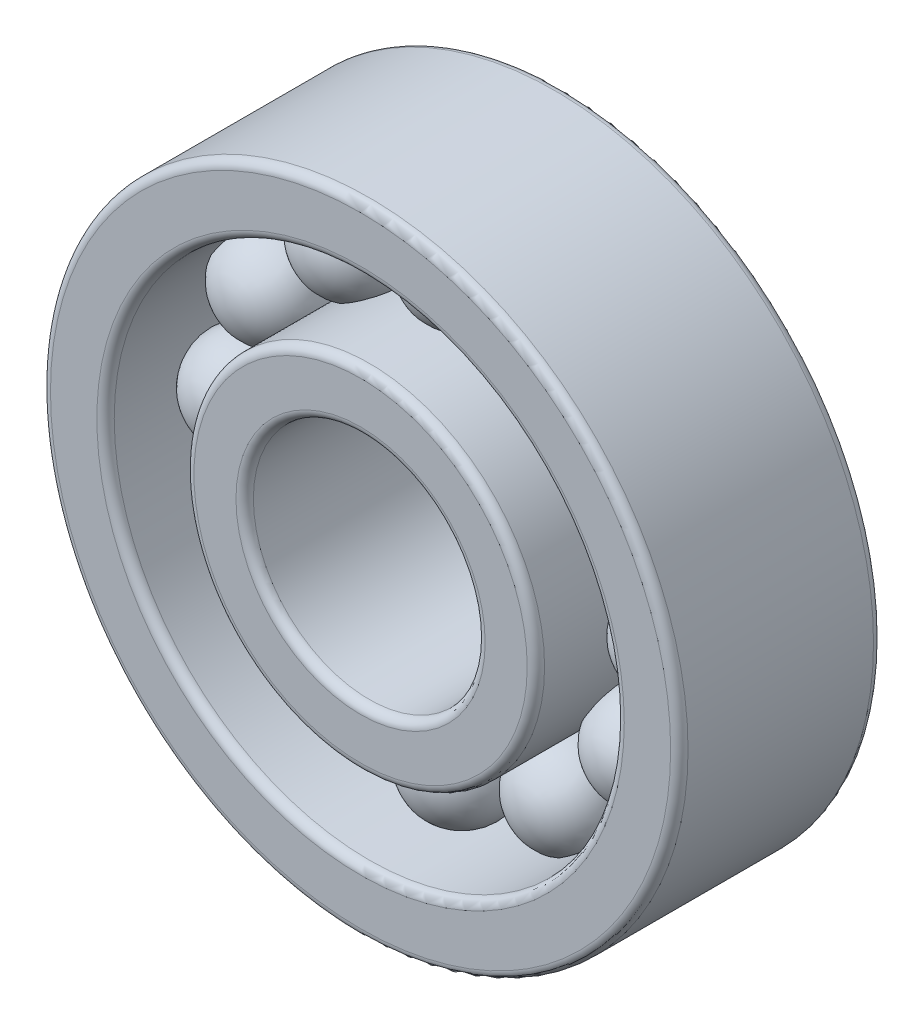
ISO-10303-21;
HEADER;
FILE_DESCRIPTION(('STEP AP214'),'2;1');
FILE_NAME('part.step','',(''),(''),'','','');
FILE_SCHEMA(('AUTOMOTIVE_DESIGN { 1 0 10303 214 1 1 1 1 }'));
ENDSEC;
DATA;
#1=APPLICATION_CONTEXT('core data for automotive mechanical design processes');
#2=APPLICATION_PROTOCOL_DEFINITION('international standard','automotive_design',2000,#1);
#3=PRODUCT_CONTEXT('',#1,'mechanical');
#4=PRODUCT('Part','Part','',(#3));
#5=PRODUCT_RELATED_PRODUCT_CATEGORY('part','',(#4));
#6=PRODUCT_DEFINITION_FORMATION('','',#4);
#7=PRODUCT_DEFINITION_CONTEXT('part definition',#1,'design');
#8=PRODUCT_DEFINITION('design','',#6,#7);
#9=PRODUCT_DEFINITION_SHAPE('','',#8);
#10=(LENGTH_UNIT() NAMED_UNIT(*) SI_UNIT(.MILLI.,.METRE.));
#11=(NAMED_UNIT(*) PLANE_ANGLE_UNIT() SI_UNIT($,.RADIAN.));
#12=(NAMED_UNIT(*) SI_UNIT($,.STERADIAN.) SOLID_ANGLE_UNIT());
#13=UNCERTAINTY_MEASURE_WITH_UNIT(LENGTH_MEASURE(1.E-05),#10,'distance_accuracy_value','');
#14=(GEOMETRIC_REPRESENTATION_CONTEXT(3) GLOBAL_UNCERTAINTY_ASSIGNED_CONTEXT((#13)) GLOBAL_UNIT_ASSIGNED_CONTEXT((#10,
#11,#12)) REPRESENTATION_CONTEXT('',''));
#15=CARTESIAN_POINT('',(0.,0.,0.));
#16=DIRECTION('',(0.,0.,1.));
#17=DIRECTION('',(1.,0.,0.));
#18=AXIS2_PLACEMENT_3D('',#15,#16,#17);
#19=CARTESIAN_POINT('',(0.,0.,3.2));
#20=DIRECTION('',(0.,0.,1.));
#21=DIRECTION('',(1.,0.,0.));
#22=AXIS2_PLACEMENT_3D('',#19,#20,#21);
#23=TOROIDAL_SURFACE('',#22,9.1,0.3);
#24=CARTESIAN_POINT('',(0.,0.,3.5));
#25=DIRECTION('',(0.,0.,1.));
#26=DIRECTION('',(1.,0.,0.));
#27=AXIS2_PLACEMENT_3D('',#24,#25,#26);
#28=CIRCLE('',#27,9.1);
#29=CARTESIAN_POINT('',(9.1,0.,3.5));
#30=VERTEX_POINT('',#29);
#31=EDGE_CURVE('P0_E20',#30,#30,#28,.T.);
#32=ORIENTED_EDGE('',*,*,#31,.T.);
#33=CARTESIAN_POINT('',(9.1,0.,3.2));
#34=DIRECTION('',(0.,-1.,0.));
#35=DIRECTION('',(1.,0.,0.));
#36=AXIS2_PLACEMENT_3D('',#33,#34,#35);
#37=CIRCLE('',#36,0.3);
#38=CARTESIAN_POINT('',(8.8,0.,3.2));
#39=VERTEX_POINT('',#38);
#40=EDGE_CURVE('P0_E11',#30,#39,#37,.T.);
#41=ORIENTED_EDGE('',*,*,#40,.T.);
#42=CARTESIAN_POINT('',(0.,0.,3.2));
#43=DIRECTION('',(0.,0.,1.));
#44=DIRECTION('',(1.,0.,0.));
#45=AXIS2_PLACEMENT_3D('',#42,#43,#44);
#46=CIRCLE('',#45,8.8);
#47=EDGE_CURVE('P0_E117',#39,#39,#46,.T.);
#48=ORIENTED_EDGE('',*,*,#47,.F.);
#49=ORIENTED_EDGE('',*,*,#40,.F.);
#50=EDGE_LOOP('',(#32,#41,#48,#49));
#51=FACE_BOUND('',#50,.T.);
#52=ADVANCED_FACE('P0_F16',(#51),#23,.T.);
#53=CARTESIAN_POINT('',(0.,0.,3.5));
#54=DIRECTION('',(0.,0.,1.));
#55=DIRECTION('',(1.,0.,0.));
#56=AXIS2_PLACEMENT_3D('',#53,#54,#55);
#57=PLANE('',#56);
#58=CARTESIAN_POINT('',(0.,0.,3.5));
#59=DIRECTION('',(0.,0.,1.));
#60=DIRECTION('',(1.,0.,0.));
#61=AXIS2_PLACEMENT_3D('',#58,#59,#60);
#62=CIRCLE('',#61,10.7);
#63=CARTESIAN_POINT('',(10.7,0.,3.5));
#64=VERTEX_POINT('',#63);
#65=EDGE_CURVE('P0_E66',#64,#64,#62,.T.);
#66=ORIENTED_EDGE('',*,*,#65,.T.);
#67=EDGE_LOOP('',(#66));
#68=FACE_BOUND('',#67,.T.);
#69=ORIENTED_EDGE('',*,*,#31,.F.);
#70=EDGE_LOOP('',(#69));
#71=FACE_BOUND('',#70,.T.);
#72=ADVANCED_FACE('P0_F18',(#68,#71),#57,.T.);
#73=CARTESIAN_POINT('',(0.,0.,3.2));
#74=DIRECTION('',(0.,0.,1.));
#75=DIRECTION('',(1.,0.,0.));
#76=AXIS2_PLACEMENT_3D('',#73,#74,#75);
#77=TOROIDAL_SURFACE('',#76,10.7,0.3);
#78=CARTESIAN_POINT('',(0.,0.,3.2));
#79=DIRECTION('',(0.,0.,1.));
#80=DIRECTION('',(1.,0.,0.));
#81=AXIS2_PLACEMENT_3D('',#78,#79,#80);
#82=CIRCLE('',#81,11.);
#83=CARTESIAN_POINT('',(11.,0.,3.2));
#84=VERTEX_POINT('',#83);
#85=EDGE_CURVE('P0_E65',#84,#84,#82,.T.);
#86=ORIENTED_EDGE('',*,*,#85,.T.);
#87=CARTESIAN_POINT('',(10.7,0.,3.2));
#88=DIRECTION('',(0.,-1.,0.));
#89=DIRECTION('',(1.,0.,0.));
#90=AXIS2_PLACEMENT_3D('',#87,#88,#89);
#91=CIRCLE('',#90,0.3);
#92=EDGE_CURVE('P0_E62',#84,#64,#91,.T.);
#93=ORIENTED_EDGE('',*,*,#92,.T.);
#94=ORIENTED_EDGE('',*,*,#65,.F.);
#95=ORIENTED_EDGE('',*,*,#92,.F.);
#96=EDGE_LOOP('',(#86,#93,#94,#95));
#97=FACE_BOUND('',#96,.T.);
#98=ADVANCED_FACE('P0_F63',(#97),#77,.T.);
#99=CARTESIAN_POINT('',(0.,0.,0.));
#100=DIRECTION('',(0.,0.,1.));
#101=DIRECTION('',(1.,0.,0.));
#102=AXIS2_PLACEMENT_3D('',#99,#100,#101);
#103=CYLINDRICAL_SURFACE('',#102,11.);
#104=CARTESIAN_POINT('',(0.,0.,-3.2));
#105=DIRECTION('',(0.,0.,1.));
#106=DIRECTION('',(1.,0.,0.));
#107=AXIS2_PLACEMENT_3D('',#104,#105,#106);
#108=CIRCLE('',#107,11.);
#109=CARTESIAN_POINT('',(11.,0.,-3.2));
#110=VERTEX_POINT('',#109);
#111=EDGE_CURVE('P0_E80',#110,#110,#108,.T.);
#112=ORIENTED_EDGE('',*,*,#111,.T.);
#113=DIRECTION('',(0.,0.,1.));
#114=VECTOR('',#113,1.);
#115=CARTESIAN_POINT('',(11.,0.,0.));
#116=LINE('',#115,#114);
#117=EDGE_CURVE('P0_E75',#110,#84,#116,.T.);
#118=ORIENTED_EDGE('',*,*,#117,.T.);
#119=ORIENTED_EDGE('',*,*,#85,.F.);
#120=ORIENTED_EDGE('',*,*,#117,.F.);
#121=EDGE_LOOP('',(#112,#118,#119,#120));
#122=FACE_BOUND('',#121,.T.);
#123=ADVANCED_FACE('P0_F95',(#122),#103,.T.);
#124=CARTESIAN_POINT('',(0.,0.,-3.2));
#125=DIRECTION('',(0.,0.,1.));
#126=DIRECTION('',(1.,0.,0.));
#127=AXIS2_PLACEMENT_3D('',#124,#125,#126);
#128=TOROIDAL_SURFACE('',#127,10.7,0.3);
#129=CARTESIAN_POINT('',(0.,0.,-3.5));
#130=DIRECTION('',(0.,0.,1.));
#131=DIRECTION('',(1.,0.,0.));
#132=AXIS2_PLACEMENT_3D('',#129,#130,#131);
#133=CIRCLE('',#132,10.7);
#134=CARTESIAN_POINT('',(10.7,0.,-3.5));
#135=VERTEX_POINT('',#134);
#136=EDGE_CURVE('P0_E84',#135,#135,#133,.T.);
#137=ORIENTED_EDGE('',*,*,#136,.T.);
#138=CARTESIAN_POINT('',(10.7,0.,-3.2));
#139=DIRECTION('',(0.,-1.,0.));
#140=DIRECTION('',(1.,0.,0.));
#141=AXIS2_PLACEMENT_3D('',#138,#139,#140);
#142=CIRCLE('',#141,0.3);
#143=EDGE_CURVE('P0_E83',#135,#110,#142,.T.);
#144=ORIENTED_EDGE('',*,*,#143,.T.);
#145=ORIENTED_EDGE('',*,*,#111,.F.);
#146=ORIENTED_EDGE('',*,*,#143,.F.);
#147=EDGE_LOOP('',(#137,#144,#145,#146));
#148=FACE_BOUND('',#147,.T.);
#149=ADVANCED_FACE('P0_F98',(#148),#128,.T.);
#150=CARTESIAN_POINT('',(0.,0.,-3.5));
#151=DIRECTION('',(0.,0.,1.));
#152=DIRECTION('',(1.,0.,0.));
#153=AXIS2_PLACEMENT_3D('',#150,#151,#152);
#154=PLANE('',#153);
#155=ORIENTED_EDGE('',*,*,#136,.F.);
#156=EDGE_LOOP('',(#155));
#157=FACE_BOUND('',#156,.T.);
#158=CARTESIAN_POINT('',(0.,0.,-3.5));
#159=DIRECTION('',(0.,0.,1.));
#160=DIRECTION('',(1.,0.,0.));
#161=AXIS2_PLACEMENT_3D('',#158,#159,#160);
#162=CIRCLE('',#161,9.1);
#163=CARTESIAN_POINT('',(9.1,0.,-3.5));
#164=VERTEX_POINT('',#163);
#165=EDGE_CURVE('P0_E78',#164,#164,#162,.T.);
#166=ORIENTED_EDGE('',*,*,#165,.T.);
#167=EDGE_LOOP('',(#166));
#168=FACE_BOUND('',#167,.T.);
#169=ADVANCED_FACE('P0_F101',(#157,#168),#154,.F.);
#170=CARTESIAN_POINT('',(0.,0.,-3.2));
#171=DIRECTION('',(0.,0.,1.));
#172=DIRECTION('',(1.,0.,0.));
#173=AXIS2_PLACEMENT_3D('',#170,#171,#172);
#174=TOROIDAL_SURFACE('',#173,9.1,0.3);
#175=CARTESIAN_POINT('',(0.,0.,-3.2));
#176=DIRECTION('',(0.,0.,1.));
#177=DIRECTION('',(1.,0.,0.));
#178=AXIS2_PLACEMENT_3D('',#175,#176,#177);
#179=CIRCLE('',#178,8.8);
#180=CARTESIAN_POINT('',(8.8,0.,-3.2));
#181=VERTEX_POINT('',#180);
#182=EDGE_CURVE('P0_E113',#181,#181,#179,.T.);
#183=ORIENTED_EDGE('',*,*,#182,.T.);
#184=CARTESIAN_POINT('',(9.1,0.,-3.2));
#185=DIRECTION('',(0.,-1.,0.));
#186=DIRECTION('',(1.,0.,0.));
#187=AXIS2_PLACEMENT_3D('',#184,#185,#186);
#188=CIRCLE('',#187,0.3);
#189=EDGE_CURVE('P0_E110',#181,#164,#188,.T.);
#190=ORIENTED_EDGE('',*,*,#189,.T.);
#191=ORIENTED_EDGE('',*,*,#165,.F.);
#192=ORIENTED_EDGE('',*,*,#189,.F.);
#193=EDGE_LOOP('',(#183,#190,#191,#192));
#194=FACE_BOUND('',#193,.T.);
#195=ADVANCED_FACE('P0_F104',(#194),#174,.T.);
#196=CARTESIAN_POINT('',(0.,0.,0.));
#197=DIRECTION('',(0.,0.,1.));
#198=DIRECTION('',(1.,0.,0.));
#199=AXIS2_PLACEMENT_3D('',#196,#197,#198);
#200=CYLINDRICAL_SURFACE('',#199,8.8);
#201=DIRECTION('',(0.,0.,1.));
#202=VECTOR('',#201,1.);
#203=CARTESIAN_POINT('',(8.8,0.,0.));
#204=LINE('',#203,#202);
#205=EDGE_CURVE('P0_E123',#181,#39,#204,.T.);
#206=ORIENTED_EDGE('',*,*,#205,.T.);
#207=ORIENTED_EDGE('',*,*,#47,.T.);
#208=ORIENTED_EDGE('',*,*,#205,.F.);
#209=ORIENTED_EDGE('',*,*,#182,.F.);
#210=EDGE_LOOP('',(#206,#207,#208,#209));
#211=FACE_BOUND('',#210,.T.);
#212=ADVANCED_FACE('P0_F130',(#211),#200,.F.);
#213=CLOSED_SHELL('',(#52,#72,#98,#123,#149,#169,#195,#212));
#214=MANIFOLD_SOLID_BREP('P0_B1',#213);
#215=CARTESIAN_POINT('',(-6.430238623099,-3.7125,0.));
#216=DIRECTION('',(0.,0.,1.));
#217=DIRECTION('',(-0.866025403784329,-0.50000000000019,0.));
#218=AXIS2_PLACEMENT_3D('',#215,#216,#217);
#219=SPHERICAL_SURFACE('',#218,1.71875);
#220=CARTESIAN_POINT('',(-6.430238623099,-3.7125,-1.71875));
#221=VERTEX_POINT('',#220);
#222=VERTEX_LOOP('',#221);
#223=FACE_BOUND('',#222,.T.);
#224=ADVANCED_FACE('P1_F14',(#223),#219,.T.);
#225=CLOSED_SHELL('',(#224));
#226=MANIFOLD_SOLID_BREP('P1_B1',#225);
#227=CARTESIAN_POINT('',(-3.7125,-6.430238623099,0.));
#228=DIRECTION('',(0.,0.,1.));
#229=DIRECTION('',(-0.50000000000019,-0.866025403784329,0.));
#230=AXIS2_PLACEMENT_3D('',#227,#228,#229);
#231=SPHERICAL_SURFACE('',#230,1.71875);
#232=CARTESIAN_POINT('',(-3.7125,-6.430238623099,-1.71875));
#233=VERTEX_POINT('',#232);
#234=VERTEX_LOOP('',#233);
#235=FACE_BOUND('',#234,.T.);
#236=ADVANCED_FACE('P2_F14',(#235),#231,.T.);
#237=CLOSED_SHELL('',(#236));
#238=MANIFOLD_SOLID_BREP('P2_B1',#237);
#239=CARTESIAN_POINT('',(0.,-7.425,0.));
#240=DIRECTION('',(0.,0.,1.));
#241=DIRECTION('',(0.,-1.,0.));
#242=AXIS2_PLACEMENT_3D('',#239,#240,#241);
#243=SPHERICAL_SURFACE('',#242,1.71875);
#244=CARTESIAN_POINT('',(0.,-7.425,-1.71875));
#245=VERTEX_POINT('',#244);
#246=VERTEX_LOOP('',#245);
#247=FACE_BOUND('',#246,.T.);
#248=ADVANCED_FACE('P3_F14',(#247),#243,.T.);
#249=CLOSED_SHELL('',(#248));
#250=MANIFOLD_SOLID_BREP('P3_B1',#249);
#251=CARTESIAN_POINT('',(3.7125,-6.430238623099,0.));
#252=DIRECTION('',(0.,0.,1.));
#253=DIRECTION('',(0.50000000000019,-0.866025403784329,0.));
#254=AXIS2_PLACEMENT_3D('',#251,#252,#253);
#255=SPHERICAL_SURFACE('',#254,1.71875);
#256=CARTESIAN_POINT('',(3.7125,-6.430238623099,-1.71875));
#257=VERTEX_POINT('',#256);
#258=VERTEX_LOOP('',#257);
#259=FACE_BOUND('',#258,.T.);
#260=ADVANCED_FACE('P4_F14',(#259),#255,.T.);
#261=CLOSED_SHELL('',(#260));
#262=MANIFOLD_SOLID_BREP('P4_B1',#261);
#263=CARTESIAN_POINT('',(6.430238623099,-3.7125,0.));
#264=DIRECTION('',(0.,0.,1.));
#265=DIRECTION('',(0.866025403784329,-0.50000000000019,0.));
#266=AXIS2_PLACEMENT_3D('',#263,#264,#265);
#267=SPHERICAL_SURFACE('',#266,1.71875);
#268=CARTESIAN_POINT('',(6.430238623099,-3.7125,-1.71875));
#269=VERTEX_POINT('',#268);
#270=VERTEX_LOOP('',#269);
#271=FACE_BOUND('',#270,.T.);
#272=ADVANCED_FACE('P5_F14',(#271),#267,.T.);
#273=CLOSED_SHELL('',(#272));
#274=MANIFOLD_SOLID_BREP('P5_B1',#273);
#275=CARTESIAN_POINT('',(0.,0.,3.2));
#276=DIRECTION('',(0.,0.,1.));
#277=DIRECTION('',(1.,0.,0.));
#278=AXIS2_PLACEMENT_3D('',#275,#276,#277);
#279=TOROIDAL_SURFACE('',#278,4.3,0.3);
#280=CARTESIAN_POINT('',(0.,0.,3.5));
#281=DIRECTION('',(0.,0.,1.));
#282=DIRECTION('',(1.,0.,0.));
#283=AXIS2_PLACEMENT_3D('',#280,#281,#282);
#284=CIRCLE('',#283,4.3);
#285=CARTESIAN_POINT('',(4.3,0.,3.5));
#286=VERTEX_POINT('',#285);
#287=EDGE_CURVE('P6_E25',#286,#286,#284,.T.);
#288=ORIENTED_EDGE('',*,*,#287,.T.);
#289=CARTESIAN_POINT('',(4.3,0.,3.2));
#290=DIRECTION('',(0.,-1.,0.));
#291=DIRECTION('',(1.,0.,0.));
#292=AXIS2_PLACEMENT_3D('',#289,#290,#291);
#293=CIRCLE('',#292,0.3);
#294=CARTESIAN_POINT('',(4.,0.,3.2));
#295=VERTEX_POINT('',#294);
#296=EDGE_CURVE('P6_E11',#286,#295,#293,.T.);
#297=ORIENTED_EDGE('',*,*,#296,.T.);
#298=CARTESIAN_POINT('',(0.,0.,3.2));
#299=DIRECTION('',(0.,0.,1.));
#300=DIRECTION('',(1.,0.,0.));
#301=AXIS2_PLACEMENT_3D('',#298,#299,#300);
#302=CIRCLE('',#301,4.);
#303=EDGE_CURVE('P6_E74',#295,#295,#302,.T.);
#304=ORIENTED_EDGE('',*,*,#303,.F.);
#305=ORIENTED_EDGE('',*,*,#296,.F.);
#306=EDGE_LOOP('',(#288,#297,#304,#305));
#307=FACE_BOUND('',#306,.T.);
#308=ADVANCED_FACE('P6_F16',(#307),#279,.T.);
#309=CARTESIAN_POINT('',(0.,0.,3.5));
#310=DIRECTION('',(0.,0.,1.));
#311=DIRECTION('',(1.,0.,0.));
#312=AXIS2_PLACEMENT_3D('',#309,#310,#311);
#313=PLANE('',#312);
#314=CARTESIAN_POINT('',(0.,0.,3.5));
#315=DIRECTION('',(0.,0.,1.));
#316=DIRECTION('',(1.,0.,0.));
#317=AXIS2_PLACEMENT_3D('',#314,#315,#316);
#318=CIRCLE('',#317,5.75);
#319=CARTESIAN_POINT('',(5.75,0.,3.5));
#320=VERTEX_POINT('',#319);
#321=EDGE_CURVE('P6_E82',#320,#320,#318,.T.);
#322=ORIENTED_EDGE('',*,*,#321,.T.);
#323=EDGE_LOOP('',(#322));
#324=FACE_BOUND('',#323,.T.);
#325=ORIENTED_EDGE('',*,*,#287,.F.);
#326=EDGE_LOOP('',(#325));
#327=FACE_BOUND('',#326,.T.);
#328=ADVANCED_FACE('P6_F105',(#324,#327),#313,.T.);
#329=CARTESIAN_POINT('',(0.,0.,3.2));
#330=DIRECTION('',(0.,0.,1.));
#331=DIRECTION('',(1.,0.,0.));
#332=AXIS2_PLACEMENT_3D('',#329,#330,#331);
#333=TOROIDAL_SURFACE('',#332,5.75,0.3);
#334=CARTESIAN_POINT('',(0.,0.,3.2));
#335=DIRECTION('',(0.,0.,1.));
#336=DIRECTION('',(1.,0.,0.));
#337=AXIS2_PLACEMENT_3D('',#334,#335,#336);
#338=CIRCLE('',#337,6.05);
#339=CARTESIAN_POINT('',(6.05,0.,3.2));
#340=VERTEX_POINT('',#339);
#341=EDGE_CURVE('P6_E97',#340,#340,#338,.T.);
#342=ORIENTED_EDGE('',*,*,#341,.T.);
#343=CARTESIAN_POINT('',(5.75,0.,3.2));
#344=DIRECTION('',(0.,-1.,0.));
#345=DIRECTION('',(1.,0.,0.));
#346=AXIS2_PLACEMENT_3D('',#343,#344,#345);
#347=CIRCLE('',#346,0.3);
#348=EDGE_CURVE('P6_E85',#340,#320,#347,.T.);
#349=ORIENTED_EDGE('',*,*,#348,.T.);
#350=ORIENTED_EDGE('',*,*,#321,.F.);
#351=ORIENTED_EDGE('',*,*,#348,.F.);
#352=EDGE_LOOP('',(#342,#349,#350,#351));
#353=FACE_BOUND('',#352,.T.);
#354=ADVANCED_FACE('P6_F107',(#353),#333,.T.);
#355=CARTESIAN_POINT('',(0.,0.,0.));
#356=DIRECTION('',(0.,0.,1.));
#357=DIRECTION('',(1.,0.,0.));
#358=AXIS2_PLACEMENT_3D('',#355,#356,#357);
#359=CYLINDRICAL_SURFACE('',#358,6.05);
#360=CARTESIAN_POINT('',(0.,0.,-3.2));
#361=DIRECTION('',(0.,0.,1.));
#362=DIRECTION('',(1.,0.,0.));
#363=AXIS2_PLACEMENT_3D('',#360,#361,#362);
#364=CIRCLE('',#363,6.05);
#365=CARTESIAN_POINT('',(6.05,0.,-3.2));
#366=VERTEX_POINT('',#365);
#367=EDGE_CURVE('P6_E89',#366,#366,#364,.T.);
#368=ORIENTED_EDGE('',*,*,#367,.T.);
#369=DIRECTION('',(0.,0.,1.));
#370=VECTOR('',#369,1.);
#371=CARTESIAN_POINT('',(6.05,0.,0.));
#372=LINE('',#371,#370);
#373=EDGE_CURVE('P6_E93',#366,#340,#372,.T.);
#374=ORIENTED_EDGE('',*,*,#373,.T.);
#375=ORIENTED_EDGE('',*,*,#341,.F.);
#376=ORIENTED_EDGE('',*,*,#373,.F.);
#377=EDGE_LOOP('',(#368,#374,#375,#376));
#378=FACE_BOUND('',#377,.T.);
#379=ADVANCED_FACE('P6_F114',(#378),#359,.T.);
#380=CARTESIAN_POINT('',(0.,0.,-3.2));
#381=DIRECTION('',(0.,0.,1.));
#382=DIRECTION('',(1.,0.,0.));
#383=AXIS2_PLACEMENT_3D('',#380,#381,#382);
#384=TOROIDAL_SURFACE('',#383,5.75,0.3);
#385=CARTESIAN_POINT('',(0.,0.,-3.5));
#386=DIRECTION('',(0.,0.,1.));
#387=DIRECTION('',(1.,0.,0.));
#388=AXIS2_PLACEMENT_3D('',#385,#386,#387);
#389=CIRCLE('',#388,5.75);
#390=CARTESIAN_POINT('',(5.75,0.,-3.5));
#391=VERTEX_POINT('',#390);
#392=EDGE_CURVE('P6_E72',#391,#391,#389,.T.);
#393=ORIENTED_EDGE('',*,*,#392,.T.);
#394=CARTESIAN_POINT('',(5.75,0.,-3.2));
#395=DIRECTION('',(0.,-1.,0.));
#396=DIRECTION('',(1.,0.,0.));
#397=AXIS2_PLACEMENT_3D('',#394,#395,#396);
#398=CIRCLE('',#397,0.3);
#399=EDGE_CURVE('P6_E81',#391,#366,#398,.T.);
#400=ORIENTED_EDGE('',*,*,#399,.T.);
#401=ORIENTED_EDGE('',*,*,#367,.F.);
#402=ORIENTED_EDGE('',*,*,#399,.F.);
#403=EDGE_LOOP('',(#393,#400,#401,#402));
#404=FACE_BOUND('',#403,.T.);
#405=ADVANCED_FACE('P6_F120',(#404),#384,.T.);
#406=CARTESIAN_POINT('',(0.,0.,-3.5));
#407=DIRECTION('',(0.,0.,1.));
#408=DIRECTION('',(1.,0.,0.));
#409=AXIS2_PLACEMENT_3D('',#406,#407,#408);
#410=PLANE('',#409);
#411=ORIENTED_EDGE('',*,*,#392,.F.);
#412=EDGE_LOOP('',(#411));
#413=FACE_BOUND('',#412,.T.);
#414=CARTESIAN_POINT('',(0.,0.,-3.5));
#415=DIRECTION('',(0.,0.,1.));
#416=DIRECTION('',(1.,0.,0.));
#417=AXIS2_PLACEMENT_3D('',#414,#415,#416);
#418=CIRCLE('',#417,4.3);
#419=CARTESIAN_POINT('',(4.3,0.,-3.5));
#420=VERTEX_POINT('',#419);
#421=EDGE_CURVE('P6_E66',#420,#420,#418,.T.);
#422=ORIENTED_EDGE('',*,*,#421,.T.);
#423=EDGE_LOOP('',(#422));
#424=FACE_BOUND('',#423,.T.);
#425=ADVANCED_FACE('P6_F124',(#413,#424),#410,.F.);
#426=CARTESIAN_POINT('',(0.,0.,-3.2));
#427=DIRECTION('',(0.,0.,1.));
#428=DIRECTION('',(1.,0.,0.));
#429=AXIS2_PLACEMENT_3D('',#426,#427,#428);
#430=TOROIDAL_SURFACE('',#429,4.3,0.3);
#431=CARTESIAN_POINT('',(0.,0.,-3.2));
#432=DIRECTION('',(0.,0.,1.));
#433=DIRECTION('',(1.,0.,0.));
#434=AXIS2_PLACEMENT_3D('',#431,#432,#433);
#435=CIRCLE('',#434,4.);
#436=CARTESIAN_POINT('',(4.,0.,-3.2));
#437=VERTEX_POINT('',#436);
#438=EDGE_CURVE('P6_E65',#437,#437,#435,.T.);
#439=ORIENTED_EDGE('',*,*,#438,.T.);
#440=CARTESIAN_POINT('',(4.3,0.,-3.2));
#441=DIRECTION('',(0.,-1.,0.));
#442=DIRECTION('',(1.,0.,0.));
#443=AXIS2_PLACEMENT_3D('',#440,#441,#442);
#444=CIRCLE('',#443,0.3);
#445=EDGE_CURVE('P6_E62',#437,#420,#444,.T.);
#446=ORIENTED_EDGE('',*,*,#445,.T.);
#447=ORIENTED_EDGE('',*,*,#421,.F.);
#448=ORIENTED_EDGE('',*,*,#445,.F.);
#449=EDGE_LOOP('',(#439,#446,#447,#448));
#450=FACE_BOUND('',#449,.T.);
#451=ADVANCED_FACE('P6_F63',(#450),#430,.T.);
#452=CARTESIAN_POINT('',(0.,0.,0.));
#453=DIRECTION('',(0.,0.,1.));
#454=DIRECTION('',(1.,0.,0.));
#455=AXIS2_PLACEMENT_3D('',#452,#453,#454);
#456=CYLINDRICAL_SURFACE('',#455,4.);
#457=DIRECTION('',(0.,0.,1.));
#458=VECTOR('',#457,1.);
#459=CARTESIAN_POINT('',(4.,0.,0.));
#460=LINE('',#459,#458);
#461=EDGE_CURVE('P6_E138',#437,#295,#460,.T.);
#462=ORIENTED_EDGE('',*,*,#461,.T.);
#463=ORIENTED_EDGE('',*,*,#303,.T.);
#464=ORIENTED_EDGE('',*,*,#461,.F.);
#465=ORIENTED_EDGE('',*,*,#438,.F.);
#466=EDGE_LOOP('',(#462,#463,#464,#465));
#467=FACE_BOUND('',#466,.T.);
#468=ADVANCED_FACE('P6_F131',(#467),#456,.F.);
#469=CLOSED_SHELL('',(#308,#328,#354,#379,#405,#425,#451,#468));
#470=MANIFOLD_SOLID_BREP('P6_B1',#469);
#471=CARTESIAN_POINT('',(7.425,0.,0.));
#472=DIRECTION('',(0.,0.,1.));
#473=DIRECTION('',(1.,0.,0.));
#474=AXIS2_PLACEMENT_3D('',#471,#472,#473);
#475=SPHERICAL_SURFACE('',#474,1.71875);
#476=CARTESIAN_POINT('',(7.425,0.,-1.71875));
#477=VERTEX_POINT('',#476);
#478=VERTEX_LOOP('',#477);
#479=FACE_BOUND('',#478,.T.);
#480=ADVANCED_FACE('P7_F14',(#479),#475,.T.);
#481=CLOSED_SHELL('',(#480));
#482=MANIFOLD_SOLID_BREP('P7_B1',#481);
#483=CARTESIAN_POINT('',(6.430238623099,3.7125,0.));
#484=DIRECTION('',(0.,0.,1.));
#485=DIRECTION('',(0.866025403784329,0.50000000000019,0.));
#486=AXIS2_PLACEMENT_3D('',#483,#484,#485);
#487=SPHERICAL_SURFACE('',#486,1.71875);
#488=CARTESIAN_POINT('',(6.430238623099,3.7125,-1.71875));
#489=VERTEX_POINT('',#488);
#490=VERTEX_LOOP('',#489);
#491=FACE_BOUND('',#490,.T.);
#492=ADVANCED_FACE('P8_F14',(#491),#487,.T.);
#493=CLOSED_SHELL('',(#492));
#494=MANIFOLD_SOLID_BREP('P8_B1',#493);
#495=CARTESIAN_POINT('',(3.7125,6.430238623099,0.));
#496=DIRECTION('',(0.,0.,1.));
#497=DIRECTION('',(0.50000000000019,0.866025403784329,0.));
#498=AXIS2_PLACEMENT_3D('',#495,#496,#497);
#499=SPHERICAL_SURFACE('',#498,1.71875);
#500=CARTESIAN_POINT('',(3.7125,6.430238623099,-1.71875));
#501=VERTEX_POINT('',#500);
#502=VERTEX_LOOP('',#501);
#503=FACE_BOUND('',#502,.T.);
#504=ADVANCED_FACE('P9_F14',(#503),#499,.T.);
#505=CLOSED_SHELL('',(#504));
#506=MANIFOLD_SOLID_BREP('P9_B1',#505);
#507=CARTESIAN_POINT('',(0.,7.425,0.));
#508=DIRECTION('',(0.,0.,1.));
#509=DIRECTION('',(0.,1.,0.));
#510=AXIS2_PLACEMENT_3D('',#507,#508,#509);
#511=SPHERICAL_SURFACE('',#510,1.71875);
#512=CARTESIAN_POINT('',(0.,7.425,-1.71875));
#513=VERTEX_POINT('',#512);
#514=VERTEX_LOOP('',#513);
#515=FACE_BOUND('',#514,.T.);
#516=ADVANCED_FACE('P10_F14',(#515),#511,.T.);
#517=CLOSED_SHELL('',(#516));
#518=MANIFOLD_SOLID_BREP('P10_B1',#517);
#519=CARTESIAN_POINT('',(-3.7125,6.430238623099,0.));
#520=DIRECTION('',(0.,0.,1.));
#521=DIRECTION('',(-0.50000000000019,0.866025403784329,0.));
#522=AXIS2_PLACEMENT_3D('',#519,#520,#521);
#523=SPHERICAL_SURFACE('',#522,1.71875);
#524=CARTESIAN_POINT('',(-3.7125,6.430238623099,-1.71875));
#525=VERTEX_POINT('',#524);
#526=VERTEX_LOOP('',#525);
#527=FACE_BOUND('',#526,.T.);
#528=ADVANCED_FACE('P11_F14',(#527),#523,.T.);
#529=CLOSED_SHELL('',(#528));
#530=MANIFOLD_SOLID_BREP('P11_B1',#529);
#531=CARTESIAN_POINT('',(-6.430238623099,3.7125,0.));
#532=DIRECTION('',(0.,0.,1.));
#533=DIRECTION('',(-0.866025403784329,0.50000000000019,0.));
#534=AXIS2_PLACEMENT_3D('',#531,#532,#533);
#535=SPHERICAL_SURFACE('',#534,1.71875);
#536=CARTESIAN_POINT('',(-6.430238623099,3.7125,-1.71875));
#537=VERTEX_POINT('',#536);
#538=VERTEX_LOOP('',#537);
#539=FACE_BOUND('',#538,.T.);
#540=ADVANCED_FACE('P12_F14',(#539),#535,.T.);
#541=CLOSED_SHELL('',(#540));
#542=MANIFOLD_SOLID_BREP('P12_B1',#541);
#543=CARTESIAN_POINT('',(-7.425,0.,0.));
#544=DIRECTION('',(0.,0.,1.));
#545=DIRECTION('',(-1.,0.,0.));
#546=AXIS2_PLACEMENT_3D('',#543,#544,#545);
#547=SPHERICAL_SURFACE('',#546,1.71875);
#548=CARTESIAN_POINT('',(-7.425,0.,-1.71875));
#549=VERTEX_POINT('',#548);
#550=VERTEX_LOOP('',#549);
#551=FACE_BOUND('',#550,.T.);
#552=ADVANCED_FACE('P13_F14',(#551),#547,.T.);
#553=CLOSED_SHELL('',(#552));
#554=MANIFOLD_SOLID_BREP('P13_B1',#553);
#555=ADVANCED_BREP_SHAPE_REPRESENTATION('',(#18,#214,#226,#238,#250,#262,#274,#470,#482,#494,
#506,#518,#530,#542,#554),#14);
#556=SHAPE_DEFINITION_REPRESENTATION(#9,#555);
ENDSEC;
END-ISO-10303-21;
